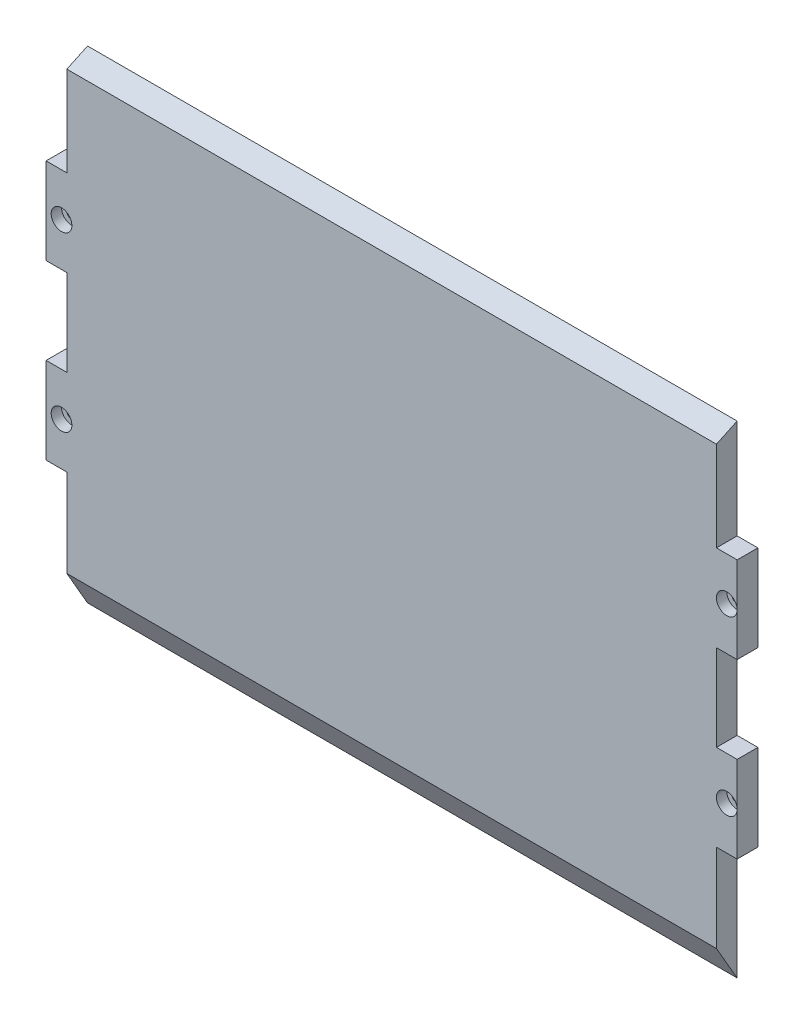
ISO-10303-21;
HEADER;
FILE_DESCRIPTION(('STEP AP214'),'2;1');
FILE_NAME('part.step','',(''),(''),'','','');
FILE_SCHEMA(('AUTOMOTIVE_DESIGN { 1 0 10303 214 1 1 1 1 }'));
ENDSEC;
DATA;
#1=APPLICATION_CONTEXT('core data for automotive mechanical design processes');
#2=APPLICATION_PROTOCOL_DEFINITION('international standard','automotive_design',2000,#1);
#3=PRODUCT_CONTEXT('',#1,'mechanical');
#4=PRODUCT('Part','Part','',(#3));
#5=PRODUCT_RELATED_PRODUCT_CATEGORY('part','',(#4));
#6=PRODUCT_DEFINITION_FORMATION('','',#4);
#7=PRODUCT_DEFINITION_CONTEXT('part definition',#1,'design');
#8=PRODUCT_DEFINITION('design','',#6,#7);
#9=PRODUCT_DEFINITION_SHAPE('','',#8);
#10=(LENGTH_UNIT() NAMED_UNIT(*) SI_UNIT(.MILLI.,.METRE.));
#11=(NAMED_UNIT(*) PLANE_ANGLE_UNIT() SI_UNIT($,.RADIAN.));
#12=(NAMED_UNIT(*) SI_UNIT($,.STERADIAN.) SOLID_ANGLE_UNIT());
#13=UNCERTAINTY_MEASURE_WITH_UNIT(LENGTH_MEASURE(1.E-05),#10,'distance_accuracy_value','');
#14=(GEOMETRIC_REPRESENTATION_CONTEXT(3) GLOBAL_UNCERTAINTY_ASSIGNED_CONTEXT((#13)) GLOBAL_UNIT_ASSIGNED_CONTEXT((#10,
#11,#12)) REPRESENTATION_CONTEXT('',''));
#15=CARTESIAN_POINT('',(0.,0.,0.));
#16=DIRECTION('',(0.,0.,1.));
#17=DIRECTION('',(1.,0.,0.));
#18=AXIS2_PLACEMENT_3D('',#15,#16,#17);
#19=CARTESIAN_POINT('',(-188.,0.,6.));
#20=DIRECTION('',(1.,0.,0.));
#21=DIRECTION('',(0.,0.,-1.));
#22=AXIS2_PLACEMENT_3D('',#19,#20,#21);
#23=PLANE('',#22);
#24=DIRECTION('',(0.,0.,1.));
#25=VECTOR('',#24,1.);
#26=CARTESIAN_POINT('',(-188.,85.8021540510701,0.));
#27=LINE('',#26,#25);
#28=CARTESIAN_POINT('',(-188.,85.8021540510701,0.));
#29=VERTEX_POINT('',#28);
#30=CARTESIAN_POINT('',(-188.,85.8021540510701,6.));
#31=VERTEX_POINT('',#30);
#32=EDGE_CURVE('E371',#29,#31,#27,.T.);
#33=ORIENTED_EDGE('',*,*,#32,.F.);
#34=DIRECTION('',(0.,-1.,0.));
#35=VECTOR('',#34,1.);
#36=CARTESIAN_POINT('',(-188.,0.,0.));
#37=LINE('',#36,#35);
#38=CARTESIAN_POINT('',(-188.,60.8021540510701,0.));
#39=VERTEX_POINT('',#38);
#40=EDGE_CURVE('E196',#29,#39,#37,.T.);
#41=ORIENTED_EDGE('',*,*,#40,.T.);
#42=DIRECTION('',(0.,0.,-1.));
#43=VECTOR('',#42,1.);
#44=CARTESIAN_POINT('',(-188.,60.8021540510701,0.));
#45=LINE('',#44,#43);
#46=CARTESIAN_POINT('',(-188.,60.8021540510701,6.));
#47=VERTEX_POINT('',#46);
#48=EDGE_CURVE('E200',#47,#39,#45,.T.);
#49=ORIENTED_EDGE('',*,*,#48,.F.);
#50=DIRECTION('',(0.,-1.,0.));
#51=VECTOR('',#50,1.);
#52=CARTESIAN_POINT('',(-188.,0.,6.));
#53=LINE('',#52,#51);
#54=EDGE_CURVE('E44',#31,#47,#53,.T.);
#55=ORIENTED_EDGE('',*,*,#54,.F.);
#56=EDGE_LOOP('',(#33,#41,#49,#55));
#57=FACE_BOUND('',#56,.T.);
#58=ADVANCED_FACE('F35',(#57),#23,.F.);
#59=DIRECTION('',(0.,0.,-1.));
#60=VECTOR('',#59,1.);
#61=CARTESIAN_POINT('',(-188.,110.80215405107,0.));
#62=LINE('',#61,#60);
#63=CARTESIAN_POINT('',(-188.,110.80215405107,6.));
#64=VERTEX_POINT('',#63);
#65=CARTESIAN_POINT('',(-188.,110.80215405107,0.));
#66=VERTEX_POINT('',#65);
#67=EDGE_CURVE('E59',#64,#66,#62,.T.);
#68=ORIENTED_EDGE('',*,*,#67,.F.);
#69=CARTESIAN_POINT('',(-188.,136.80215405107,6.));
#70=VERTEX_POINT('',#69);
#71=EDGE_CURVE('E11',#70,#64,#53,.T.);
#72=ORIENTED_EDGE('',*,*,#71,.F.);
#73=DIRECTION('',(0.,0.422618261740692,-0.906307787036654));
#74=VECTOR('',#73,1.);
#75=CARTESIAN_POINT('',(-188.,112.368441826764,58.3982649587635));
#76=LINE('',#75,#74);
#77=CARTESIAN_POINT('',(-188.,139.6,0.));
#78=VERTEX_POINT('',#77);
#79=EDGE_CURVE('E350',#70,#78,#76,.T.);
#80=ORIENTED_EDGE('',*,*,#79,.T.);
#81=EDGE_CURVE('E247',#78,#66,#37,.T.);
#82=ORIENTED_EDGE('',*,*,#81,.T.);
#83=EDGE_LOOP('',(#68,#72,#80,#82));
#84=FACE_BOUND('',#83,.T.);
#85=ADVANCED_FACE('F364',(#84),#23,.F.);
#86=DIRECTION('',(0.,0.,1.));
#87=VECTOR('',#86,1.);
#88=CARTESIAN_POINT('',(-188.,35.8021540510701,0.));
#89=LINE('',#88,#87);
#90=CARTESIAN_POINT('',(-188.,35.8021540510701,0.));
#91=VERTEX_POINT('',#90);
#92=CARTESIAN_POINT('',(-188.,35.8021540510701,6.));
#93=VERTEX_POINT('',#92);
#94=EDGE_CURVE('E197',#91,#93,#89,.T.);
#95=ORIENTED_EDGE('',*,*,#94,.F.);
#96=CARTESIAN_POINT('',(-188.,0.,0.));
#97=VERTEX_POINT('',#96);
#98=EDGE_CURVE('E222',#91,#97,#37,.T.);
#99=ORIENTED_EDGE('',*,*,#98,.T.);
#100=DIRECTION('',(0.,-0.866025403784438,-0.500000000000001));
#101=VECTOR('',#100,1.);
#102=CARTESIAN_POINT('',(-188.,2.5980762113533,1.5));
#103=LINE('',#102,#101);
#104=CARTESIAN_POINT('',(-188.,10.3923048454132,6.));
#105=VERTEX_POINT('',#104);
#106=EDGE_CURVE('E339',#105,#97,#103,.T.);
#107=ORIENTED_EDGE('',*,*,#106,.F.);
#108=EDGE_CURVE('E260',#93,#105,#53,.T.);
#109=ORIENTED_EDGE('',*,*,#108,.F.);
#110=EDGE_LOOP('',(#95,#99,#107,#109));
#111=FACE_BOUND('',#110,.T.);
#112=ADVANCED_FACE('F460',(#111),#23,.F.);
#113=CARTESIAN_POINT('',(0.,0.,6.));
#114=DIRECTION('',(-1.,0.,0.));
#115=DIRECTION('',(0.,0.,1.));
#116=AXIS2_PLACEMENT_3D('',#113,#114,#115);
#117=PLANE('',#116);
#118=DIRECTION('',(0.,0.,1.));
#119=VECTOR('',#118,1.);
#120=CARTESIAN_POINT('',(0.,60.8021540510701,0.));
#121=LINE('',#120,#119);
#122=CARTESIAN_POINT('',(0.,60.8021540510701,0.));
#123=VERTEX_POINT('',#122);
#124=CARTESIAN_POINT('',(0.,60.8021540510701,6.));
#125=VERTEX_POINT('',#124);
#126=EDGE_CURVE('E234',#123,#125,#121,.T.);
#127=ORIENTED_EDGE('',*,*,#126,.F.);
#128=DIRECTION('',(0.,1.,0.));
#129=VECTOR('',#128,1.);
#130=CARTESIAN_POINT('',(0.,0.,0.));
#131=LINE('',#130,#129);
#132=CARTESIAN_POINT('',(0.,85.8021540510701,0.));
#133=VERTEX_POINT('',#132);
#134=EDGE_CURVE('E277',#123,#133,#131,.T.);
#135=ORIENTED_EDGE('',*,*,#134,.T.);
#136=DIRECTION('',(0.,0.,-1.));
#137=VECTOR('',#136,1.);
#138=CARTESIAN_POINT('',(0.,85.8021540510701,0.));
#139=LINE('',#138,#137);
#140=CARTESIAN_POINT('',(0.,85.8021540510701,6.));
#141=VERTEX_POINT('',#140);
#142=EDGE_CURVE('E305',#141,#133,#139,.T.);
#143=ORIENTED_EDGE('',*,*,#142,.F.);
#144=DIRECTION('',(0.,1.,0.));
#145=VECTOR('',#144,1.);
#146=CARTESIAN_POINT('',(0.,0.,6.));
#147=LINE('',#146,#145);
#148=EDGE_CURVE('E290',#125,#141,#147,.T.);
#149=ORIENTED_EDGE('',*,*,#148,.F.);
#150=EDGE_LOOP('',(#127,#135,#143,#149));
#151=FACE_BOUND('',#150,.T.);
#152=ADVANCED_FACE('F37',(#151),#117,.F.);
#153=DIRECTION('',(0.,0.,-1.));
#154=VECTOR('',#153,1.);
#155=CARTESIAN_POINT('',(0.,35.8021540510701,0.));
#156=LINE('',#155,#154);
#157=CARTESIAN_POINT('',(0.,35.8021540510701,6.));
#158=VERTEX_POINT('',#157);
#159=CARTESIAN_POINT('',(0.,35.8021540510701,0.));
#160=VERTEX_POINT('',#159);
#161=EDGE_CURVE('E791',#158,#160,#156,.T.);
#162=ORIENTED_EDGE('',*,*,#161,.F.);
#163=CARTESIAN_POINT('',(0.,10.3923048454132,6.));
#164=VERTEX_POINT('',#163);
#165=EDGE_CURVE('E261',#164,#158,#147,.T.);
#166=ORIENTED_EDGE('',*,*,#165,.F.);
#167=DIRECTION('',(0.,0.866025403784438,0.500000000000001));
#168=VECTOR('',#167,1.);
#169=CARTESIAN_POINT('',(0.,2.59807621135332,1.50000000000001));
#170=LINE('',#169,#168);
#171=CARTESIAN_POINT('',(0.,0.,0.));
#172=VERTEX_POINT('',#171);
#173=EDGE_CURVE('E344',#172,#164,#170,.T.);
#174=ORIENTED_EDGE('',*,*,#173,.F.);
#175=EDGE_CURVE('E276',#172,#160,#131,.T.);
#176=ORIENTED_EDGE('',*,*,#175,.T.);
#177=EDGE_LOOP('',(#162,#166,#174,#176));
#178=FACE_BOUND('',#177,.T.);
#179=ADVANCED_FACE('F470',(#178),#117,.F.);
#180=DIRECTION('',(0.,0.,1.));
#181=VECTOR('',#180,1.);
#182=CARTESIAN_POINT('',(0.,110.80215405107,0.));
#183=LINE('',#182,#181);
#184=CARTESIAN_POINT('',(0.,110.80215405107,0.));
#185=VERTEX_POINT('',#184);
#186=CARTESIAN_POINT('',(0.,110.80215405107,6.));
#187=VERTEX_POINT('',#186);
#188=EDGE_CURVE('E301',#185,#187,#183,.T.);
#189=ORIENTED_EDGE('',*,*,#188,.F.);
#190=CARTESIAN_POINT('',(0.,139.6,0.));
#191=VERTEX_POINT('',#190);
#192=EDGE_CURVE('E273',#185,#191,#131,.T.);
#193=ORIENTED_EDGE('',*,*,#192,.T.);
#194=DIRECTION('',(0.,-0.422618261740692,0.906307787036654));
#195=VECTOR('',#194,1.);
#196=CARTESIAN_POINT('',(0.,112.368441826764,58.3982649587635));
#197=LINE('',#196,#195);
#198=CARTESIAN_POINT('',(0.,136.80215405107,6.));
#199=VERTEX_POINT('',#198);
#200=EDGE_CURVE('E286',#191,#199,#197,.T.);
#201=ORIENTED_EDGE('',*,*,#200,.T.);
#202=EDGE_CURVE('E291',#187,#199,#147,.T.);
#203=ORIENTED_EDGE('',*,*,#202,.F.);
#204=EDGE_LOOP('',(#189,#193,#201,#203));
#205=FACE_BOUND('',#204,.T.);
#206=ADVANCED_FACE('F355',(#205),#117,.F.);
#207=CARTESIAN_POINT('',(0.,0.,6.));
#208=DIRECTION('',(0.,0.,1.));
#209=DIRECTION('',(1.,0.,0.));
#210=AXIS2_PLACEMENT_3D('',#207,#208,#209);
#211=PLANE('',#210);
#212=CARTESIAN_POINT('',(-189.537877077125,98.3021540510701,6.));
#213=DIRECTION('',(0.,0.,1.));
#214=DIRECTION('',(1.,0.,0.));
#215=AXIS2_PLACEMENT_3D('',#212,#213,#214);
#216=CIRCLE('',#215,2.995);
#217=CARTESIAN_POINT('',(-186.542877077125,98.3021540510701,6.));
#218=VERTEX_POINT('',#217);
#219=EDGE_CURVE('E393',#218,#218,#216,.T.);
#220=ORIENTED_EDGE('',*,*,#219,.F.);
#221=EDGE_LOOP('',(#220));
#222=FACE_BOUND('',#221,.T.);
#223=CARTESIAN_POINT('',(-189.537877077125,48.3021540510701,6.));
#224=DIRECTION('',(0.,0.,1.));
#225=DIRECTION('',(1.,0.,0.));
#226=AXIS2_PLACEMENT_3D('',#223,#224,#225);
#227=CIRCLE('',#226,2.995);
#228=CARTESIAN_POINT('',(-186.542877077125,48.3021540510701,6.));
#229=VERTEX_POINT('',#228);
#230=EDGE_CURVE('E387',#229,#229,#227,.T.);
#231=ORIENTED_EDGE('',*,*,#230,.F.);
#232=EDGE_LOOP('',(#231));
#233=FACE_BOUND('',#232,.T.);
#234=CARTESIAN_POINT('',(3.,98.3021540510701,6.));
#235=DIRECTION('',(0.,0.,1.));
#236=DIRECTION('',(1.,0.,0.));
#237=AXIS2_PLACEMENT_3D('',#234,#235,#236);
#238=CIRCLE('',#237,2.995);
#239=CARTESIAN_POINT('',(5.995,98.3021540510701,6.));
#240=VERTEX_POINT('',#239);
#241=EDGE_CURVE('E381',#240,#240,#238,.T.);
#242=ORIENTED_EDGE('',*,*,#241,.F.);
#243=EDGE_LOOP('',(#242));
#244=FACE_BOUND('',#243,.T.);
#245=CARTESIAN_POINT('',(3.,48.3021540510701,6.));
#246=DIRECTION('',(0.,0.,1.));
#247=DIRECTION('',(1.,0.,0.));
#248=AXIS2_PLACEMENT_3D('',#245,#246,#247);
#249=CIRCLE('',#248,2.995);
#250=CARTESIAN_POINT('',(5.995,48.3021540510701,6.));
#251=VERTEX_POINT('',#250);
#252=EDGE_CURVE('E375',#251,#251,#249,.T.);
#253=ORIENTED_EDGE('',*,*,#252,.F.);
#254=EDGE_LOOP('',(#253));
#255=FACE_BOUND('',#254,.T.);
#256=ORIENTED_EDGE('',*,*,#71,.T.);
#257=DIRECTION('',(1.,0.,0.));
#258=VECTOR('',#257,1.);
#259=CARTESIAN_POINT('',(-194.,110.80215405107,6.));
#260=LINE('',#259,#258);
#261=CARTESIAN_POINT('',(-194.,110.80215405107,6.));
#262=VERTEX_POINT('',#261);
#263=EDGE_CURVE('E202',#262,#64,#260,.T.);
#264=ORIENTED_EDGE('',*,*,#263,.F.);
#265=DIRECTION('',(0.,1.,0.));
#266=VECTOR('',#265,1.);
#267=CARTESIAN_POINT('',(-194.,85.8021540510701,6.));
#268=LINE('',#267,#266);
#269=CARTESIAN_POINT('',(-194.,85.8021540510701,6.));
#270=VERTEX_POINT('',#269);
#271=EDGE_CURVE('E183',#270,#262,#268,.T.);
#272=ORIENTED_EDGE('',*,*,#271,.F.);
#273=DIRECTION('',(1.,0.,0.));
#274=VECTOR('',#273,1.);
#275=CARTESIAN_POINT('',(-194.,85.8021540510701,6.));
#276=LINE('',#275,#274);
#277=EDGE_CURVE('E180',#270,#31,#276,.T.);
#278=ORIENTED_EDGE('',*,*,#277,.T.);
#279=ORIENTED_EDGE('',*,*,#54,.T.);
#280=DIRECTION('',(1.,0.,0.));
#281=VECTOR('',#280,1.);
#282=CARTESIAN_POINT('',(-194.,60.8021540510701,6.));
#283=LINE('',#282,#281);
#284=CARTESIAN_POINT('',(-194.,60.8021540510701,6.));
#285=VERTEX_POINT('',#284);
#286=EDGE_CURVE('E229',#285,#47,#283,.T.);
#287=ORIENTED_EDGE('',*,*,#286,.F.);
#288=DIRECTION('',(0.,1.,0.));
#289=VECTOR('',#288,1.);
#290=CARTESIAN_POINT('',(-194.,35.8021540510701,6.));
#291=LINE('',#290,#289);
#292=CARTESIAN_POINT('',(-194.,35.8021540510701,6.));
#293=VERTEX_POINT('',#292);
#294=EDGE_CURVE('E211',#293,#285,#291,.T.);
#295=ORIENTED_EDGE('',*,*,#294,.F.);
#296=DIRECTION('',(1.,0.,0.));
#297=VECTOR('',#296,1.);
#298=CARTESIAN_POINT('',(-194.,35.8021540510701,6.));
#299=LINE('',#298,#297);
#300=EDGE_CURVE('E225',#293,#93,#299,.T.);
#301=ORIENTED_EDGE('',*,*,#300,.T.);
#302=ORIENTED_EDGE('',*,*,#108,.T.);
#303=DIRECTION('',(-1.,0.,0.));
#304=VECTOR('',#303,1.);
#305=CARTESIAN_POINT('',(292.799419398332,10.3923048454132,6.));
#306=LINE('',#305,#304);
#307=EDGE_CURVE('E316',#164,#105,#306,.T.);
#308=ORIENTED_EDGE('',*,*,#307,.F.);
#309=ORIENTED_EDGE('',*,*,#165,.T.);
#310=DIRECTION('',(-1.,0.,0.));
#311=VECTOR('',#310,1.);
#312=CARTESIAN_POINT('',(6.,35.8021540510701,6.));
#313=LINE('',#312,#311);
#314=CARTESIAN_POINT('',(6.,35.8021540510701,6.));
#315=VERTEX_POINT('',#314);
#316=EDGE_CURVE('E799',#315,#158,#313,.T.);
#317=ORIENTED_EDGE('',*,*,#316,.F.);
#318=DIRECTION('',(0.,-1.,0.));
#319=VECTOR('',#318,1.);
#320=CARTESIAN_POINT('',(6.,60.8021540510701,6.));
#321=LINE('',#320,#319);
#322=CARTESIAN_POINT('',(6.,60.8021540510701,6.));
#323=VERTEX_POINT('',#322);
#324=EDGE_CURVE('E823',#323,#315,#321,.T.);
#325=ORIENTED_EDGE('',*,*,#324,.F.);
#326=DIRECTION('',(-1.,0.,0.));
#327=VECTOR('',#326,1.);
#328=CARTESIAN_POINT('',(6.,60.8021540510701,6.));
#329=LINE('',#328,#327);
#330=EDGE_CURVE('E802',#323,#125,#329,.T.);
#331=ORIENTED_EDGE('',*,*,#330,.T.);
#332=ORIENTED_EDGE('',*,*,#148,.T.);
#333=DIRECTION('',(-1.,0.,0.));
#334=VECTOR('',#333,1.);
#335=CARTESIAN_POINT('',(6.,85.8021540510701,6.));
#336=LINE('',#335,#334);
#337=CARTESIAN_POINT('',(6.,85.8021540510701,6.));
#338=VERTEX_POINT('',#337);
#339=EDGE_CURVE('E327',#338,#141,#336,.T.);
#340=ORIENTED_EDGE('',*,*,#339,.F.);
#341=DIRECTION('',(0.,-1.,0.));
#342=VECTOR('',#341,1.);
#343=CARTESIAN_POINT('',(6.,110.80215405107,6.));
#344=LINE('',#343,#342);
#345=CARTESIAN_POINT('',(6.,110.80215405107,6.));
#346=VERTEX_POINT('',#345);
#347=EDGE_CURVE('E813',#346,#338,#344,.T.);
#348=ORIENTED_EDGE('',*,*,#347,.F.);
#349=DIRECTION('',(-1.,0.,0.));
#350=VECTOR('',#349,1.);
#351=CARTESIAN_POINT('',(6.,110.80215405107,6.));
#352=LINE('',#351,#350);
#353=EDGE_CURVE('E307',#346,#187,#352,.T.);
#354=ORIENTED_EDGE('',*,*,#353,.T.);
#355=ORIENTED_EDGE('',*,*,#202,.T.);
#356=DIRECTION('',(-1.,0.,0.));
#357=VECTOR('',#356,1.);
#358=CARTESIAN_POINT('',(292.799419398332,136.80215405107,6.));
#359=LINE('',#358,#357);
#360=EDGE_CURVE('E346',#199,#70,#359,.T.);
#361=ORIENTED_EDGE('',*,*,#360,.T.);
#362=EDGE_LOOP('',(#256,#264,#272,#278,#279,#287,#295,#301,#302,#308,#309,#317,#325,#331,#332,
#340,#348,#354,#355,#361));
#363=FACE_BOUND('',#362,.T.);
#364=ADVANCED_FACE('F361',(#222,#233,#244,#255,#363),#211,.T.);
#365=CARTESIAN_POINT('',(0.,0.,0.));
#366=DIRECTION('',(0.,0.,1.));
#367=DIRECTION('',(1.,0.,0.));
#368=AXIS2_PLACEMENT_3D('',#365,#366,#367);
#369=PLANE('',#368);
#370=CARTESIAN_POINT('',(-189.537877077125,98.3021540510701,0.));
#371=DIRECTION('',(0.,0.,1.));
#372=DIRECTION('',(1.,0.,0.));
#373=AXIS2_PLACEMENT_3D('',#370,#371,#372);
#374=CIRCLE('',#373,1.5);
#375=CARTESIAN_POINT('',(-188.037877077125,98.3021540510701,0.));
#376=VERTEX_POINT('',#375);
#377=EDGE_CURVE('E410',#376,#376,#374,.T.);
#378=ORIENTED_EDGE('',*,*,#377,.T.);
#379=EDGE_LOOP('',(#378));
#380=FACE_BOUND('',#379,.T.);
#381=CARTESIAN_POINT('',(-189.537877077125,48.3021540510701,0.));
#382=DIRECTION('',(0.,0.,1.));
#383=DIRECTION('',(1.,0.,0.));
#384=AXIS2_PLACEMENT_3D('',#381,#382,#383);
#385=CIRCLE('',#384,1.5);
#386=CARTESIAN_POINT('',(-188.037877077125,48.3021540510701,0.));
#387=VERTEX_POINT('',#386);
#388=EDGE_CURVE('E406',#387,#387,#385,.T.);
#389=ORIENTED_EDGE('',*,*,#388,.T.);
#390=EDGE_LOOP('',(#389));
#391=FACE_BOUND('',#390,.T.);
#392=CARTESIAN_POINT('',(3.,48.3021540510701,0.));
#393=DIRECTION('',(0.,0.,1.));
#394=DIRECTION('',(1.,0.,0.));
#395=AXIS2_PLACEMENT_3D('',#392,#393,#394);
#396=CIRCLE('',#395,1.5);
#397=CARTESIAN_POINT('',(4.5,48.3021540510701,0.));
#398=VERTEX_POINT('',#397);
#399=EDGE_CURVE('E402',#398,#398,#396,.T.);
#400=ORIENTED_EDGE('',*,*,#399,.T.);
#401=EDGE_LOOP('',(#400));
#402=FACE_BOUND('',#401,.T.);
#403=CARTESIAN_POINT('',(3.,98.3021540510701,0.));
#404=DIRECTION('',(0.,0.,1.));
#405=DIRECTION('',(1.,0.,0.));
#406=AXIS2_PLACEMENT_3D('',#403,#404,#405);
#407=CIRCLE('',#406,1.5);
#408=CARTESIAN_POINT('',(4.5,98.3021540510701,0.));
#409=VERTEX_POINT('',#408);
#410=EDGE_CURVE('E396',#409,#409,#407,.T.);
#411=ORIENTED_EDGE('',*,*,#410,.T.);
#412=EDGE_LOOP('',(#411));
#413=FACE_BOUND('',#412,.T.);
#414=ORIENTED_EDGE('',*,*,#175,.F.);
#415=DIRECTION('',(1.,0.,0.));
#416=VECTOR('',#415,1.);
#417=CARTESIAN_POINT('',(0.,0.,0.));
#418=LINE('',#417,#416);
#419=EDGE_CURVE('E255',#97,#172,#418,.T.);
#420=ORIENTED_EDGE('',*,*,#419,.F.);
#421=ORIENTED_EDGE('',*,*,#98,.F.);
#422=DIRECTION('',(1.,0.,0.));
#423=VECTOR('',#422,1.);
#424=CARTESIAN_POINT('',(-194.,35.8021540510701,0.));
#425=LINE('',#424,#423);
#426=CARTESIAN_POINT('',(-194.,35.8021540510701,0.));
#427=VERTEX_POINT('',#426);
#428=EDGE_CURVE('E228',#427,#91,#425,.T.);
#429=ORIENTED_EDGE('',*,*,#428,.F.);
#430=DIRECTION('',(0.,-1.,0.));
#431=VECTOR('',#430,1.);
#432=CARTESIAN_POINT('',(-194.,35.8021540510701,0.));
#433=LINE('',#432,#431);
#434=CARTESIAN_POINT('',(-194.,60.8021540510701,0.));
#435=VERTEX_POINT('',#434);
#436=EDGE_CURVE('E206',#435,#427,#433,.T.);
#437=ORIENTED_EDGE('',*,*,#436,.F.);
#438=DIRECTION('',(1.,0.,0.));
#439=VECTOR('',#438,1.);
#440=CARTESIAN_POINT('',(-194.,60.8021540510701,0.));
#441=LINE('',#440,#439);
#442=EDGE_CURVE('E215',#435,#39,#441,.T.);
#443=ORIENTED_EDGE('',*,*,#442,.T.);
#444=ORIENTED_EDGE('',*,*,#40,.F.);
#445=DIRECTION('',(1.,0.,0.));
#446=VECTOR('',#445,1.);
#447=CARTESIAN_POINT('',(-194.,85.8021540510701,0.));
#448=LINE('',#447,#446);
#449=CARTESIAN_POINT('',(-194.,85.8021540510701,0.));
#450=VERTEX_POINT('',#449);
#451=EDGE_CURVE('E178',#450,#29,#448,.T.);
#452=ORIENTED_EDGE('',*,*,#451,.F.);
#453=DIRECTION('',(0.,-1.,0.));
#454=VECTOR('',#453,1.);
#455=CARTESIAN_POINT('',(-194.,85.8021540510701,0.));
#456=LINE('',#455,#454);
#457=CARTESIAN_POINT('',(-194.,110.80215405107,0.));
#458=VERTEX_POINT('',#457);
#459=EDGE_CURVE('E184',#458,#450,#456,.T.);
#460=ORIENTED_EDGE('',*,*,#459,.F.);
#461=DIRECTION('',(1.,0.,0.));
#462=VECTOR('',#461,1.);
#463=CARTESIAN_POINT('',(-194.,110.80215405107,0.));
#464=LINE('',#463,#462);
#465=EDGE_CURVE('E365',#458,#66,#464,.T.);
#466=ORIENTED_EDGE('',*,*,#465,.T.);
#467=ORIENTED_EDGE('',*,*,#81,.F.);
#468=DIRECTION('',(-1.,0.,0.));
#469=VECTOR('',#468,1.);
#470=CARTESIAN_POINT('',(0.,139.6,0.));
#471=LINE('',#470,#469);
#472=EDGE_CURVE('E253',#191,#78,#471,.T.);
#473=ORIENTED_EDGE('',*,*,#472,.F.);
#474=ORIENTED_EDGE('',*,*,#192,.F.);
#475=DIRECTION('',(-1.,0.,0.));
#476=VECTOR('',#475,1.);
#477=CARTESIAN_POINT('',(6.,110.80215405107,0.));
#478=LINE('',#477,#476);
#479=CARTESIAN_POINT('',(6.,110.80215405107,0.));
#480=VERTEX_POINT('',#479);
#481=EDGE_CURVE('E332',#480,#185,#478,.T.);
#482=ORIENTED_EDGE('',*,*,#481,.F.);
#483=DIRECTION('',(0.,1.,0.));
#484=VECTOR('',#483,1.);
#485=CARTESIAN_POINT('',(6.,110.80215405107,0.));
#486=LINE('',#485,#484);
#487=CARTESIAN_POINT('',(6.,85.8021540510701,0.));
#488=VERTEX_POINT('',#487);
#489=EDGE_CURVE('E321',#488,#480,#486,.T.);
#490=ORIENTED_EDGE('',*,*,#489,.F.);
#491=DIRECTION('',(-1.,0.,0.));
#492=VECTOR('',#491,1.);
#493=CARTESIAN_POINT('',(6.,85.8021540510701,0.));
#494=LINE('',#493,#492);
#495=EDGE_CURVE('E324',#488,#133,#494,.T.);
#496=ORIENTED_EDGE('',*,*,#495,.T.);
#497=ORIENTED_EDGE('',*,*,#134,.F.);
#498=DIRECTION('',(-1.,0.,0.));
#499=VECTOR('',#498,1.);
#500=CARTESIAN_POINT('',(6.,60.8021540510701,0.));
#501=LINE('',#500,#499);
#502=CARTESIAN_POINT('',(6.,60.8021540510701,0.));
#503=VERTEX_POINT('',#502);
#504=EDGE_CURVE('E306',#503,#123,#501,.T.);
#505=ORIENTED_EDGE('',*,*,#504,.F.);
#506=DIRECTION('',(0.,1.,0.));
#507=VECTOR('',#506,1.);
#508=CARTESIAN_POINT('',(6.,60.8021540510701,0.));
#509=LINE('',#508,#507);
#510=CARTESIAN_POINT('',(6.,35.8021540510701,0.));
#511=VERTEX_POINT('',#510);
#512=EDGE_CURVE('E795',#511,#503,#509,.T.);
#513=ORIENTED_EDGE('',*,*,#512,.F.);
#514=DIRECTION('',(-1.,0.,0.));
#515=VECTOR('',#514,1.);
#516=CARTESIAN_POINT('',(6.,35.8021540510701,0.));
#517=LINE('',#516,#515);
#518=EDGE_CURVE('E803',#511,#160,#517,.T.);
#519=ORIENTED_EDGE('',*,*,#518,.T.);
#520=EDGE_LOOP('',(#414,#420,#421,#429,#437,#443,#444,#452,#460,#466,#467,#473,#474,#482,#490,
#496,#497,#505,#513,#519));
#521=FACE_BOUND('',#520,.T.);
#522=ADVANCED_FACE('F194',(#380,#391,#402,#413,#521),#369,.F.);
#523=CARTESIAN_POINT('',(292.799419398332,139.6,0.));
#524=DIRECTION('',(0.,-0.906307787036654,-0.422618261740691));
#525=DIRECTION('',(0.,0.422618261740692,-0.906307787036654));
#526=AXIS2_PLACEMENT_3D('',#523,#524,#525);
#527=PLANE('',#526);
#528=ORIENTED_EDGE('',*,*,#200,.F.);
#529=ORIENTED_EDGE('',*,*,#472,.T.);
#530=ORIENTED_EDGE('',*,*,#79,.F.);
#531=ORIENTED_EDGE('',*,*,#360,.F.);
#532=EDGE_LOOP('',(#528,#529,#530,#531));
#533=FACE_BOUND('',#532,.T.);
#534=ADVANCED_FACE('F360',(#533),#527,.F.);
#535=CARTESIAN_POINT('',(292.799419398332,0.,0.));
#536=DIRECTION('',(0.,-0.500000000000001,0.866025403784438));
#537=DIRECTION('',(0.,-0.866025403784438,-0.500000000000001));
#538=AXIS2_PLACEMENT_3D('',#535,#536,#537);
#539=PLANE('',#538);
#540=ORIENTED_EDGE('',*,*,#419,.T.);
#541=ORIENTED_EDGE('',*,*,#173,.T.);
#542=ORIENTED_EDGE('',*,*,#307,.T.);
#543=ORIENTED_EDGE('',*,*,#106,.T.);
#544=EDGE_LOOP('',(#540,#541,#542,#543));
#545=FACE_BOUND('',#544,.T.);
#546=ADVANCED_FACE('F521',(#545),#539,.T.);
#547=CARTESIAN_POINT('',(6.,110.80215405107,0.));
#548=DIRECTION('',(0.,-1.,0.));
#549=DIRECTION('',(0.,0.,-1.));
#550=AXIS2_PLACEMENT_3D('',#547,#548,#549);
#551=PLANE('',#550);
#552=ORIENTED_EDGE('',*,*,#188,.T.);
#553=ORIENTED_EDGE('',*,*,#353,.F.);
#554=DIRECTION('',(0.,0.,1.));
#555=VECTOR('',#554,1.);
#556=CARTESIAN_POINT('',(6.,110.80215405107,0.));
#557=LINE('',#556,#555);
#558=EDGE_CURVE('E812',#480,#346,#557,.T.);
#559=ORIENTED_EDGE('',*,*,#558,.F.);
#560=ORIENTED_EDGE('',*,*,#481,.T.);
#561=EDGE_LOOP('',(#552,#553,#559,#560));
#562=FACE_BOUND('',#561,.T.);
#563=ADVANCED_FACE('F518',(#562),#551,.F.);
#564=CARTESIAN_POINT('',(6.,85.8021540510701,0.));
#565=DIRECTION('',(0.,1.,0.));
#566=DIRECTION('',(0.,0.,1.));
#567=AXIS2_PLACEMENT_3D('',#564,#565,#566);
#568=PLANE('',#567);
#569=ORIENTED_EDGE('',*,*,#142,.T.);
#570=ORIENTED_EDGE('',*,*,#495,.F.);
#571=DIRECTION('',(0.,0.,-1.));
#572=VECTOR('',#571,1.);
#573=CARTESIAN_POINT('',(6.,85.8021540510701,0.));
#574=LINE('',#573,#572);
#575=EDGE_CURVE('E312',#338,#488,#574,.T.);
#576=ORIENTED_EDGE('',*,*,#575,.F.);
#577=ORIENTED_EDGE('',*,*,#339,.T.);
#578=EDGE_LOOP('',(#569,#570,#576,#577));
#579=FACE_BOUND('',#578,.T.);
#580=ADVANCED_FACE('F514',(#579),#568,.F.);
#581=CARTESIAN_POINT('',(6.,0.,0.));
#582=DIRECTION('',(-1.,0.,0.));
#583=DIRECTION('',(0.,0.,1.));
#584=AXIS2_PLACEMENT_3D('',#581,#582,#583);
#585=PLANE('',#584);
#586=ORIENTED_EDGE('',*,*,#489,.T.);
#587=ORIENTED_EDGE('',*,*,#558,.T.);
#588=ORIENTED_EDGE('',*,*,#347,.T.);
#589=ORIENTED_EDGE('',*,*,#575,.T.);
#590=EDGE_LOOP('',(#586,#587,#588,#589));
#591=FACE_BOUND('',#590,.T.);
#592=ADVANCED_FACE('F510',(#591),#585,.F.);
#593=CARTESIAN_POINT('',(6.,60.8021540510701,0.));
#594=DIRECTION('',(0.,-1.,0.));
#595=DIRECTION('',(0.,0.,-1.));
#596=AXIS2_PLACEMENT_3D('',#593,#594,#595);
#597=PLANE('',#596);
#598=ORIENTED_EDGE('',*,*,#126,.T.);
#599=ORIENTED_EDGE('',*,*,#330,.F.);
#600=DIRECTION('',(0.,0.,1.));
#601=VECTOR('',#600,1.);
#602=CARTESIAN_POINT('',(6.,60.8021540510701,0.));
#603=LINE('',#602,#601);
#604=EDGE_CURVE('E821',#503,#323,#603,.T.);
#605=ORIENTED_EDGE('',*,*,#604,.F.);
#606=ORIENTED_EDGE('',*,*,#504,.T.);
#607=EDGE_LOOP('',(#598,#599,#605,#606));
#608=FACE_BOUND('',#607,.T.);
#609=ADVANCED_FACE('F506',(#608),#597,.F.);
#610=CARTESIAN_POINT('',(6.,35.8021540510701,0.));
#611=DIRECTION('',(0.,1.,0.));
#612=DIRECTION('',(0.,0.,1.));
#613=AXIS2_PLACEMENT_3D('',#610,#611,#612);
#614=PLANE('',#613);
#615=ORIENTED_EDGE('',*,*,#161,.T.);
#616=ORIENTED_EDGE('',*,*,#518,.F.);
#617=DIRECTION('',(0.,0.,-1.));
#618=VECTOR('',#617,1.);
#619=CARTESIAN_POINT('',(6.,35.8021540510701,0.));
#620=LINE('',#619,#618);
#621=EDGE_CURVE('E801',#315,#511,#620,.T.);
#622=ORIENTED_EDGE('',*,*,#621,.F.);
#623=ORIENTED_EDGE('',*,*,#316,.T.);
#624=EDGE_LOOP('',(#615,#616,#622,#623));
#625=FACE_BOUND('',#624,.T.);
#626=ADVANCED_FACE('F502',(#625),#614,.F.);
#627=CARTESIAN_POINT('',(6.,0.,0.));
#628=DIRECTION('',(-1.,0.,0.));
#629=DIRECTION('',(0.,0.,1.));
#630=AXIS2_PLACEMENT_3D('',#627,#628,#629);
#631=PLANE('',#630);
#632=ORIENTED_EDGE('',*,*,#512,.T.);
#633=ORIENTED_EDGE('',*,*,#604,.T.);
#634=ORIENTED_EDGE('',*,*,#324,.T.);
#635=ORIENTED_EDGE('',*,*,#621,.T.);
#636=EDGE_LOOP('',(#632,#633,#634,#635));
#637=FACE_BOUND('',#636,.T.);
#638=ADVANCED_FACE('F499',(#637),#631,.F.);
#639=CARTESIAN_POINT('',(-194.,35.8021540510701,0.));
#640=DIRECTION('',(0.,1.,0.));
#641=DIRECTION('',(0.,0.,1.));
#642=AXIS2_PLACEMENT_3D('',#639,#640,#641);
#643=PLANE('',#642);
#644=ORIENTED_EDGE('',*,*,#94,.T.);
#645=ORIENTED_EDGE('',*,*,#300,.F.);
#646=DIRECTION('',(0.,0.,1.));
#647=VECTOR('',#646,1.);
#648=CARTESIAN_POINT('',(-194.,35.8021540510701,0.));
#649=LINE('',#648,#647);
#650=EDGE_CURVE('E209',#427,#293,#649,.T.);
#651=ORIENTED_EDGE('',*,*,#650,.F.);
#652=ORIENTED_EDGE('',*,*,#428,.T.);
#653=EDGE_LOOP('',(#644,#645,#651,#652));
#654=FACE_BOUND('',#653,.T.);
#655=ADVANCED_FACE('F477',(#654),#643,.F.);
#656=CARTESIAN_POINT('',(-194.,60.8021540510701,0.));
#657=DIRECTION('',(0.,-1.,0.));
#658=DIRECTION('',(0.,0.,-1.));
#659=AXIS2_PLACEMENT_3D('',#656,#657,#658);
#660=PLANE('',#659);
#661=ORIENTED_EDGE('',*,*,#48,.T.);
#662=ORIENTED_EDGE('',*,*,#442,.F.);
#663=DIRECTION('',(0.,0.,-1.));
#664=VECTOR('',#663,1.);
#665=CARTESIAN_POINT('',(-194.,60.8021540510701,0.));
#666=LINE('',#665,#664);
#667=EDGE_CURVE('E213',#285,#435,#666,.T.);
#668=ORIENTED_EDGE('',*,*,#667,.F.);
#669=ORIENTED_EDGE('',*,*,#286,.T.);
#670=EDGE_LOOP('',(#661,#662,#668,#669));
#671=FACE_BOUND('',#670,.T.);
#672=ADVANCED_FACE('F484',(#671),#660,.F.);
#673=CARTESIAN_POINT('',(-194.,0.,0.));
#674=DIRECTION('',(1.,0.,0.));
#675=DIRECTION('',(0.,0.,-1.));
#676=AXIS2_PLACEMENT_3D('',#673,#674,#675);
#677=PLANE('',#676);
#678=ORIENTED_EDGE('',*,*,#436,.T.);
#679=ORIENTED_EDGE('',*,*,#650,.T.);
#680=ORIENTED_EDGE('',*,*,#294,.T.);
#681=ORIENTED_EDGE('',*,*,#667,.T.);
#682=EDGE_LOOP('',(#678,#679,#680,#681));
#683=FACE_BOUND('',#682,.T.);
#684=ADVANCED_FACE('F480',(#683),#677,.F.);
#685=CARTESIAN_POINT('',(-194.,85.8021540510701,0.));
#686=DIRECTION('',(0.,1.,0.));
#687=DIRECTION('',(0.,0.,1.));
#688=AXIS2_PLACEMENT_3D('',#685,#686,#687);
#689=PLANE('',#688);
#690=ORIENTED_EDGE('',*,*,#32,.T.);
#691=ORIENTED_EDGE('',*,*,#277,.F.);
#692=DIRECTION('',(0.,0.,1.));
#693=VECTOR('',#692,1.);
#694=CARTESIAN_POINT('',(-194.,85.8021540510701,0.));
#695=LINE('',#694,#693);
#696=EDGE_CURVE('E174',#450,#270,#695,.T.);
#697=ORIENTED_EDGE('',*,*,#696,.F.);
#698=ORIENTED_EDGE('',*,*,#451,.T.);
#699=EDGE_LOOP('',(#690,#691,#697,#698));
#700=FACE_BOUND('',#699,.T.);
#701=ADVANCED_FACE('F176',(#700),#689,.F.);
#702=CARTESIAN_POINT('',(-194.,110.80215405107,0.));
#703=DIRECTION('',(0.,-1.,0.));
#704=DIRECTION('',(0.,0.,-1.));
#705=AXIS2_PLACEMENT_3D('',#702,#703,#704);
#706=PLANE('',#705);
#707=ORIENTED_EDGE('',*,*,#67,.T.);
#708=ORIENTED_EDGE('',*,*,#465,.F.);
#709=DIRECTION('',(0.,0.,-1.));
#710=VECTOR('',#709,1.);
#711=CARTESIAN_POINT('',(-194.,110.80215405107,0.));
#712=LINE('',#711,#710);
#713=EDGE_CURVE('E189',#262,#458,#712,.T.);
#714=ORIENTED_EDGE('',*,*,#713,.F.);
#715=ORIENTED_EDGE('',*,*,#263,.T.);
#716=EDGE_LOOP('',(#707,#708,#714,#715));
#717=FACE_BOUND('',#716,.T.);
#718=ADVANCED_FACE('F456',(#717),#706,.F.);
#719=CARTESIAN_POINT('',(-194.,0.,0.));
#720=DIRECTION('',(1.,0.,0.));
#721=DIRECTION('',(0.,0.,-1.));
#722=AXIS2_PLACEMENT_3D('',#719,#720,#721);
#723=PLANE('',#722);
#724=ORIENTED_EDGE('',*,*,#459,.T.);
#725=ORIENTED_EDGE('',*,*,#696,.T.);
#726=ORIENTED_EDGE('',*,*,#271,.T.);
#727=ORIENTED_EDGE('',*,*,#713,.T.);
#728=EDGE_LOOP('',(#724,#725,#726,#727));
#729=FACE_BOUND('',#728,.T.);
#730=ADVANCED_FACE('F187',(#729),#723,.F.);
#731=CARTESIAN_POINT('',(3.,48.3021540510701,3.));
#732=DIRECTION('',(0.,0.,1.));
#733=DIRECTION('',(1.,0.,0.));
#734=AXIS2_PLACEMENT_3D('',#731,#732,#733);
#735=CYLINDRICAL_SURFACE('',#734,2.995);
#736=CARTESIAN_POINT('',(3.,48.3021540510701,3.));
#737=DIRECTION('',(0.,0.,1.));
#738=DIRECTION('',(1.,0.,0.));
#739=AXIS2_PLACEMENT_3D('',#736,#737,#738);
#740=CIRCLE('',#739,2.995);
#741=CARTESIAN_POINT('',(5.995,48.3021540510701,3.));
#742=VERTEX_POINT('',#741);
#743=EDGE_CURVE('E372',#742,#742,#740,.T.);
#744=ORIENTED_EDGE('',*,*,#743,.F.);
#745=EDGE_LOOP('',(#744));
#746=FACE_BOUND('',#745,.T.);
#747=ORIENTED_EDGE('',*,*,#252,.T.);
#748=EDGE_LOOP('',(#747));
#749=FACE_BOUND('',#748,.T.);
#750=ADVANCED_FACE('F444',(#746,#749),#735,.F.);
#751=CARTESIAN_POINT('',(3.,48.3021540510701,3.));
#752=DIRECTION('',(0.,0.,1.));
#753=DIRECTION('',(1.,0.,0.));
#754=AXIS2_PLACEMENT_3D('',#751,#752,#753);
#755=PLANE('',#754);
#756=CARTESIAN_POINT('',(3.,48.3021540510701,3.));
#757=DIRECTION('',(0.,0.,1.));
#758=DIRECTION('',(1.,0.,0.));
#759=AXIS2_PLACEMENT_3D('',#756,#757,#758);
#760=CIRCLE('',#759,1.5);
#761=CARTESIAN_POINT('',(4.5,48.3021540510701,3.));
#762=VERTEX_POINT('',#761);
#763=EDGE_CURVE('E405',#762,#762,#760,.T.);
#764=ORIENTED_EDGE('',*,*,#763,.F.);
#765=EDGE_LOOP('',(#764));
#766=FACE_BOUND('',#765,.T.);
#767=ORIENTED_EDGE('',*,*,#743,.T.);
#768=EDGE_LOOP('',(#767));
#769=FACE_BOUND('',#768,.T.);
#770=ADVANCED_FACE('F446',(#766,#769),#755,.T.);
#771=CARTESIAN_POINT('',(3.,98.3021540510701,3.));
#772=DIRECTION('',(0.,0.,1.));
#773=DIRECTION('',(1.,0.,0.));
#774=AXIS2_PLACEMENT_3D('',#771,#772,#773);
#775=CYLINDRICAL_SURFACE('',#774,2.995);
#776=CARTESIAN_POINT('',(3.,98.3021540510701,3.));
#777=DIRECTION('',(0.,0.,1.));
#778=DIRECTION('',(1.,0.,0.));
#779=AXIS2_PLACEMENT_3D('',#776,#777,#778);
#780=CIRCLE('',#779,2.995);
#781=CARTESIAN_POINT('',(5.995,98.3021540510701,3.));
#782=VERTEX_POINT('',#781);
#783=EDGE_CURVE('E378',#782,#782,#780,.T.);
#784=ORIENTED_EDGE('',*,*,#783,.F.);
#785=EDGE_LOOP('',(#784));
#786=FACE_BOUND('',#785,.T.);
#787=ORIENTED_EDGE('',*,*,#241,.T.);
#788=EDGE_LOOP('',(#787));
#789=FACE_BOUND('',#788,.T.);
#790=ADVANCED_FACE('F453',(#786,#789),#775,.F.);
#791=CARTESIAN_POINT('',(3.,98.3021540510701,3.));
#792=DIRECTION('',(0.,0.,1.));
#793=DIRECTION('',(1.,0.,0.));
#794=AXIS2_PLACEMENT_3D('',#791,#792,#793);
#795=PLANE('',#794);
#796=CARTESIAN_POINT('',(3.,98.3021540510701,3.));
#797=DIRECTION('',(0.,0.,1.));
#798=DIRECTION('',(1.,0.,0.));
#799=AXIS2_PLACEMENT_3D('',#796,#797,#798);
#800=CIRCLE('',#799,1.5);
#801=CARTESIAN_POINT('',(4.5,98.3021540510701,3.));
#802=VERTEX_POINT('',#801);
#803=EDGE_CURVE('E401',#802,#802,#800,.T.);
#804=ORIENTED_EDGE('',*,*,#803,.F.);
#805=EDGE_LOOP('',(#804));
#806=FACE_BOUND('',#805,.T.);
#807=ORIENTED_EDGE('',*,*,#783,.T.);
#808=EDGE_LOOP('',(#807));
#809=FACE_BOUND('',#808,.T.);
#810=ADVANCED_FACE('F554',(#806,#809),#795,.T.);
#811=CARTESIAN_POINT('',(-189.537877077125,48.3021540510701,3.));
#812=DIRECTION('',(0.,0.,1.));
#813=DIRECTION('',(1.,0.,0.));
#814=AXIS2_PLACEMENT_3D('',#811,#812,#813);
#815=CYLINDRICAL_SURFACE('',#814,2.995);
#816=CARTESIAN_POINT('',(-189.537877077125,48.3021540510701,3.));
#817=DIRECTION('',(0.,0.,1.));
#818=DIRECTION('',(1.,0.,0.));
#819=AXIS2_PLACEMENT_3D('',#816,#817,#818);
#820=CIRCLE('',#819,2.995);
#821=CARTESIAN_POINT('',(-186.542877077125,48.3021540510701,3.));
#822=VERTEX_POINT('',#821);
#823=EDGE_CURVE('E384',#822,#822,#820,.T.);
#824=ORIENTED_EDGE('',*,*,#823,.F.);
#825=EDGE_LOOP('',(#824));
#826=FACE_BOUND('',#825,.T.);
#827=ORIENTED_EDGE('',*,*,#230,.T.);
#828=EDGE_LOOP('',(#827));
#829=FACE_BOUND('',#828,.T.);
#830=ADVANCED_FACE('F550',(#826,#829),#815,.F.);
#831=CARTESIAN_POINT('',(-189.537877077125,48.3021540510701,3.));
#832=DIRECTION('',(0.,0.,1.));
#833=DIRECTION('',(1.,0.,0.));
#834=AXIS2_PLACEMENT_3D('',#831,#832,#833);
#835=PLANE('',#834);
#836=CARTESIAN_POINT('',(-189.537877077125,48.3021540510701,3.));
#837=DIRECTION('',(0.,0.,1.));
#838=DIRECTION('',(1.,0.,0.));
#839=AXIS2_PLACEMENT_3D('',#836,#837,#838);
#840=CIRCLE('',#839,1.5);
#841=CARTESIAN_POINT('',(-188.037877077125,48.3021540510701,3.));
#842=VERTEX_POINT('',#841);
#843=EDGE_CURVE('E409',#842,#842,#840,.T.);
#844=ORIENTED_EDGE('',*,*,#843,.F.);
#845=EDGE_LOOP('',(#844));
#846=FACE_BOUND('',#845,.T.);
#847=ORIENTED_EDGE('',*,*,#823,.T.);
#848=EDGE_LOOP('',(#847));
#849=FACE_BOUND('',#848,.T.);
#850=ADVANCED_FACE('F431',(#846,#849),#835,.T.);
#851=CARTESIAN_POINT('',(-189.537877077125,98.3021540510701,3.));
#852=DIRECTION('',(0.,0.,1.));
#853=DIRECTION('',(1.,0.,0.));
#854=AXIS2_PLACEMENT_3D('',#851,#852,#853);
#855=CYLINDRICAL_SURFACE('',#854,2.995);
#856=CARTESIAN_POINT('',(-189.537877077125,98.3021540510701,3.));
#857=DIRECTION('',(0.,0.,1.));
#858=DIRECTION('',(1.,0.,0.));
#859=AXIS2_PLACEMENT_3D('',#856,#857,#858);
#860=CIRCLE('',#859,2.995);
#861=CARTESIAN_POINT('',(-186.542877077125,98.3021540510701,3.));
#862=VERTEX_POINT('',#861);
#863=EDGE_CURVE('E390',#862,#862,#860,.T.);
#864=ORIENTED_EDGE('',*,*,#863,.F.);
#865=EDGE_LOOP('',(#864));
#866=FACE_BOUND('',#865,.T.);
#867=ORIENTED_EDGE('',*,*,#219,.T.);
#868=EDGE_LOOP('',(#867));
#869=FACE_BOUND('',#868,.T.);
#870=ADVANCED_FACE('F425',(#866,#869),#855,.F.);
#871=CARTESIAN_POINT('',(-189.537877077125,98.3021540510701,3.));
#872=DIRECTION('',(0.,0.,1.));
#873=DIRECTION('',(1.,0.,0.));
#874=AXIS2_PLACEMENT_3D('',#871,#872,#873);
#875=PLANE('',#874);
#876=CARTESIAN_POINT('',(-189.537877077125,98.3021540510701,3.));
#877=DIRECTION('',(0.,0.,1.));
#878=DIRECTION('',(1.,0.,0.));
#879=AXIS2_PLACEMENT_3D('',#876,#877,#878);
#880=CIRCLE('',#879,1.5);
#881=CARTESIAN_POINT('',(-188.037877077125,98.3021540510701,3.));
#882=VERTEX_POINT('',#881);
#883=EDGE_CURVE('E39',#882,#882,#880,.T.);
#884=ORIENTED_EDGE('',*,*,#883,.F.);
#885=EDGE_LOOP('',(#884));
#886=FACE_BOUND('',#885,.T.);
#887=ORIENTED_EDGE('',*,*,#863,.T.);
#888=EDGE_LOOP('',(#887));
#889=FACE_BOUND('',#888,.T.);
#890=ADVANCED_FACE('F421',(#886,#889),#875,.T.);
#891=CARTESIAN_POINT('',(3.,98.3021540510701,-7.));
#892=DIRECTION('',(0.,0.,1.));
#893=DIRECTION('',(1.,0.,0.));
#894=AXIS2_PLACEMENT_3D('',#891,#892,#893);
#895=CYLINDRICAL_SURFACE('',#894,1.5);
#896=ORIENTED_EDGE('',*,*,#803,.T.);
#897=EDGE_LOOP('',(#896));
#898=FACE_BOUND('',#897,.T.);
#899=ORIENTED_EDGE('',*,*,#410,.F.);
#900=EDGE_LOOP('',(#899));
#901=FACE_BOUND('',#900,.T.);
#902=ADVANCED_FACE('F424',(#898,#901),#895,.F.);
#903=CARTESIAN_POINT('',(3.,48.3021540510701,-7.));
#904=DIRECTION('',(0.,0.,1.));
#905=DIRECTION('',(1.,0.,0.));
#906=AXIS2_PLACEMENT_3D('',#903,#904,#905);
#907=CYLINDRICAL_SURFACE('',#906,1.5);
#908=ORIENTED_EDGE('',*,*,#763,.T.);
#909=EDGE_LOOP('',(#908));
#910=FACE_BOUND('',#909,.T.);
#911=ORIENTED_EDGE('',*,*,#399,.F.);
#912=EDGE_LOOP('',(#911));
#913=FACE_BOUND('',#912,.T.);
#914=ADVANCED_FACE('F536',(#910,#913),#907,.F.);
#915=CARTESIAN_POINT('',(-189.537877077125,48.3021540510701,-7.));
#916=DIRECTION('',(0.,0.,1.));
#917=DIRECTION('',(1.,0.,0.));
#918=AXIS2_PLACEMENT_3D('',#915,#916,#917);
#919=CYLINDRICAL_SURFACE('',#918,1.5);
#920=ORIENTED_EDGE('',*,*,#843,.T.);
#921=EDGE_LOOP('',(#920));
#922=FACE_BOUND('',#921,.T.);
#923=ORIENTED_EDGE('',*,*,#388,.F.);
#924=EDGE_LOOP('',(#923));
#925=FACE_BOUND('',#924,.T.);
#926=ADVANCED_FACE('F542',(#922,#925),#919,.F.);
#927=CARTESIAN_POINT('',(-189.537877077125,98.3021540510701,-7.));
#928=DIRECTION('',(0.,0.,1.));
#929=DIRECTION('',(1.,0.,0.));
#930=AXIS2_PLACEMENT_3D('',#927,#928,#929);
#931=CYLINDRICAL_SURFACE('',#930,1.5);
#932=ORIENTED_EDGE('',*,*,#883,.T.);
#933=EDGE_LOOP('',(#932));
#934=FACE_BOUND('',#933,.T.);
#935=ORIENTED_EDGE('',*,*,#377,.F.);
#936=EDGE_LOOP('',(#935));
#937=FACE_BOUND('',#936,.T.);
#938=ADVANCED_FACE('F418',(#934,#937),#931,.F.);
#939=CLOSED_SHELL('',(#58,#85,#112,#152,#179,#206,#364,#522,#534,#546,#563,#580,#592,#609,#626,
#638,#655,#672,#684,#701,#718,#730,#750,#770,#790,#810,#830,#850,#870,#890,#902,#914,#926,#938));
#940=MANIFOLD_SOLID_BREP('B2',#939);
#941=ADVANCED_BREP_SHAPE_REPRESENTATION('',(#18,#940),#14);
#942=SHAPE_DEFINITION_REPRESENTATION(#9,#941);
ENDSEC;
END-ISO-10303-21;
